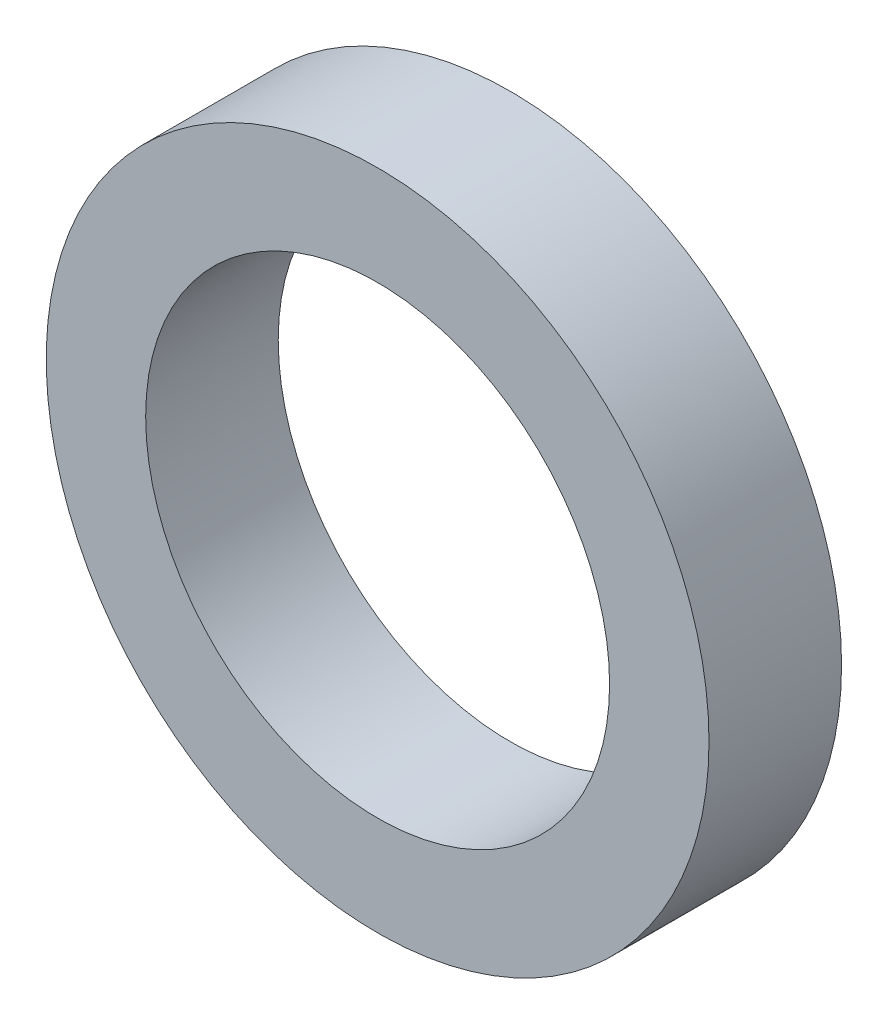
ISO-10303-21;
HEADER;
FILE_DESCRIPTION(('STEP AP214'),'2;1');
FILE_NAME('part.step','',(''),(''),'','','');
FILE_SCHEMA(('AUTOMOTIVE_DESIGN { 1 0 10303 214 1 1 1 1 }'));
ENDSEC;
DATA;
#1=APPLICATION_CONTEXT('core data for automotive mechanical design processes');
#2=APPLICATION_PROTOCOL_DEFINITION('international standard','automotive_design',2000,#1);
#3=PRODUCT_CONTEXT('',#1,'mechanical');
#4=PRODUCT('Part','Part','',(#3));
#5=PRODUCT_RELATED_PRODUCT_CATEGORY('part','',(#4));
#6=PRODUCT_DEFINITION_FORMATION('','',#4);
#7=PRODUCT_DEFINITION_CONTEXT('part definition',#1,'design');
#8=PRODUCT_DEFINITION('design','',#6,#7);
#9=PRODUCT_DEFINITION_SHAPE('','',#8);
#10=(LENGTH_UNIT() NAMED_UNIT(*) SI_UNIT(.MILLI.,.METRE.));
#11=(NAMED_UNIT(*) PLANE_ANGLE_UNIT() SI_UNIT($,.RADIAN.));
#12=(NAMED_UNIT(*) SI_UNIT($,.STERADIAN.) SOLID_ANGLE_UNIT());
#13=UNCERTAINTY_MEASURE_WITH_UNIT(LENGTH_MEASURE(1.E-05),#10,'distance_accuracy_value','');
#14=(GEOMETRIC_REPRESENTATION_CONTEXT(3) GLOBAL_UNCERTAINTY_ASSIGNED_CONTEXT((#13)) GLOBAL_UNIT_ASSIGNED_CONTEXT((#10,
#11,#12)) REPRESENTATION_CONTEXT('',''));
#15=CARTESIAN_POINT('',(0.,0.,0.));
#16=DIRECTION('',(0.,0.,1.));
#17=DIRECTION('',(1.,0.,0.));
#18=AXIS2_PLACEMENT_3D('',#15,#16,#17);
#19=CARTESIAN_POINT('',(0.,0.,2.));
#20=DIRECTION('',(0.,0.,1.));
#21=DIRECTION('',(1.,0.,0.));
#22=AXIS2_PLACEMENT_3D('',#19,#20,#21);
#23=PLANE('',#22);
#24=CARTESIAN_POINT('',(0.,0.,2.));
#25=DIRECTION('',(0.,0.,1.));
#26=DIRECTION('',(1.,0.,0.));
#27=AXIS2_PLACEMENT_3D('',#24,#25,#26);
#28=CIRCLE('',#27,5.);
#29=CARTESIAN_POINT('',(5.,0.,2.));
#30=VERTEX_POINT('',#29);
#31=EDGE_CURVE('E10',#30,#30,#28,.T.);
#32=ORIENTED_EDGE('',*,*,#31,.T.);
#33=EDGE_LOOP('',(#32));
#34=FACE_BOUND('',#33,.T.);
#35=CARTESIAN_POINT('',(0.,0.,2.));
#36=DIRECTION('',(0.,0.,1.));
#37=DIRECTION('',(1.,0.,0.));
#38=AXIS2_PLACEMENT_3D('',#35,#36,#37);
#39=CIRCLE('',#38,3.5);
#40=CARTESIAN_POINT('',(3.5,0.,2.));
#41=VERTEX_POINT('',#40);
#42=EDGE_CURVE('E50',#41,#41,#39,.T.);
#43=ORIENTED_EDGE('',*,*,#42,.F.);
#44=EDGE_LOOP('',(#43));
#45=FACE_BOUND('',#44,.T.);
#46=ADVANCED_FACE('F37',(#34,#45),#23,.T.);
#47=CARTESIAN_POINT('',(0.,0.,0.));
#48=DIRECTION('',(0.,0.,1.));
#49=DIRECTION('',(1.,0.,0.));
#50=AXIS2_PLACEMENT_3D('',#47,#48,#49);
#51=PLANE('',#50);
#52=CARTESIAN_POINT('',(0.,0.,0.));
#53=DIRECTION('',(0.,0.,1.));
#54=DIRECTION('',(1.,0.,0.));
#55=AXIS2_PLACEMENT_3D('',#52,#53,#54);
#56=CIRCLE('',#55,5.);
#57=CARTESIAN_POINT('',(5.,0.,0.));
#58=VERTEX_POINT('',#57);
#59=EDGE_CURVE('E41',#58,#58,#56,.T.);
#60=ORIENTED_EDGE('',*,*,#59,.F.);
#61=EDGE_LOOP('',(#60));
#62=FACE_BOUND('',#61,.T.);
#63=CARTESIAN_POINT('',(0.,0.,0.));
#64=DIRECTION('',(0.,0.,1.));
#65=DIRECTION('',(1.,0.,0.));
#66=AXIS2_PLACEMENT_3D('',#63,#64,#65);
#67=CIRCLE('',#66,3.5);
#68=CARTESIAN_POINT('',(3.5,0.,0.));
#69=VERTEX_POINT('',#68);
#70=EDGE_CURVE('E52',#69,#69,#67,.T.);
#71=ORIENTED_EDGE('',*,*,#70,.T.);
#72=EDGE_LOOP('',(#71));
#73=FACE_BOUND('',#72,.T.);
#74=ADVANCED_FACE('F64',(#62,#73),#51,.F.);
#75=CARTESIAN_POINT('',(0.,0.,2.));
#76=DIRECTION('',(0.,0.,-1.));
#77=DIRECTION('',(-1.,0.,0.));
#78=AXIS2_PLACEMENT_3D('',#75,#76,#77);
#79=CYLINDRICAL_SURFACE('',#78,5.);
#80=ORIENTED_EDGE('',*,*,#31,.F.);
#81=EDGE_LOOP('',(#80));
#82=FACE_BOUND('',#81,.T.);
#83=ORIENTED_EDGE('',*,*,#59,.T.);
#84=EDGE_LOOP('',(#83));
#85=FACE_BOUND('',#84,.T.);
#86=ADVANCED_FACE('F39',(#82,#85),#79,.T.);
#87=CARTESIAN_POINT('',(0.,0.,2.));
#88=DIRECTION('',(0.,0.,-1.));
#89=DIRECTION('',(-1.,0.,0.));
#90=AXIS2_PLACEMENT_3D('',#87,#88,#89);
#91=CYLINDRICAL_SURFACE('',#90,3.5);
#92=ORIENTED_EDGE('',*,*,#42,.T.);
#93=EDGE_LOOP('',(#92));
#94=FACE_BOUND('',#93,.T.);
#95=ORIENTED_EDGE('',*,*,#70,.F.);
#96=EDGE_LOOP('',(#95));
#97=FACE_BOUND('',#96,.T.);
#98=ADVANCED_FACE('F60',(#94,#97),#91,.F.);
#99=CLOSED_SHELL('',(#46,#74,#86,#98));
#100=MANIFOLD_SOLID_BREP('B2',#99);
#101=ADVANCED_BREP_SHAPE_REPRESENTATION('',(#18,#100),#14);
#102=SHAPE_DEFINITION_REPRESENTATION(#9,#101);
ENDSEC;
END-ISO-10303-21;
